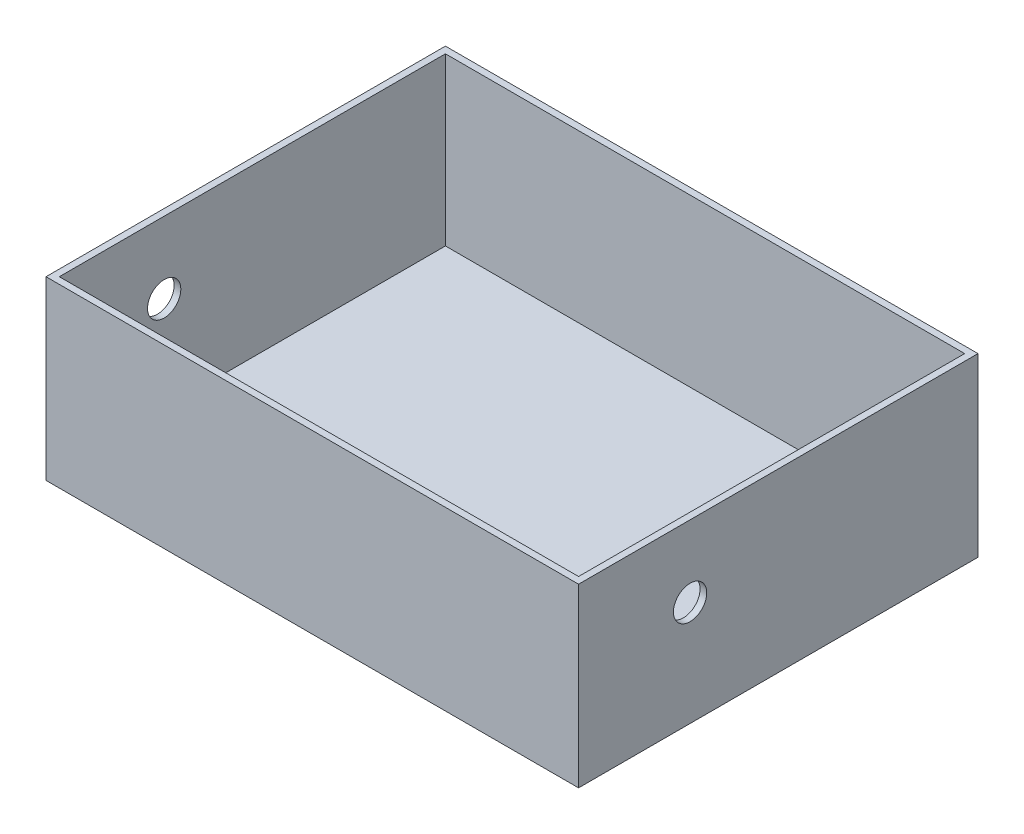
ISO-10303-21;
HEADER;
FILE_DESCRIPTION(('STEP AP214'),'2;1');
FILE_NAME('part.step','',(''),(''),'','','');
FILE_SCHEMA(('AUTOMOTIVE_DESIGN { 1 0 10303 214 1 1 1 1 }'));
ENDSEC;
DATA;
#1=APPLICATION_CONTEXT('core data for automotive mechanical design processes');
#2=APPLICATION_PROTOCOL_DEFINITION('international standard','automotive_design',2000,#1);
#3=PRODUCT_CONTEXT('',#1,'mechanical');
#4=PRODUCT('Part','Part','',(#3));
#5=PRODUCT_RELATED_PRODUCT_CATEGORY('part','',(#4));
#6=PRODUCT_DEFINITION_FORMATION('','',#4);
#7=PRODUCT_DEFINITION_CONTEXT('part definition',#1,'design');
#8=PRODUCT_DEFINITION('design','',#6,#7);
#9=PRODUCT_DEFINITION_SHAPE('','',#8);
#10=(LENGTH_UNIT() NAMED_UNIT(*) SI_UNIT(.MILLI.,.METRE.));
#11=(NAMED_UNIT(*) PLANE_ANGLE_UNIT() SI_UNIT($,.RADIAN.));
#12=(NAMED_UNIT(*) SI_UNIT($,.STERADIAN.) SOLID_ANGLE_UNIT());
#13=UNCERTAINTY_MEASURE_WITH_UNIT(LENGTH_MEASURE(1.E-05),#10,'distance_accuracy_value','');
#14=(GEOMETRIC_REPRESENTATION_CONTEXT(3) GLOBAL_UNCERTAINTY_ASSIGNED_CONTEXT((#13)) GLOBAL_UNIT_ASSIGNED_CONTEXT((#10,
#11,#12)) REPRESENTATION_CONTEXT('',''));
#15=CARTESIAN_POINT('',(0.,0.,0.));
#16=DIRECTION('',(0.,0.,1.));
#17=DIRECTION('',(1.,0.,0.));
#18=AXIS2_PLACEMENT_3D('',#15,#16,#17);
#19=CARTESIAN_POINT('',(80.,3.,60.));
#20=DIRECTION('',(-1.,0.,0.));
#21=DIRECTION('',(0.,0.,1.));
#22=AXIS2_PLACEMENT_3D('',#19,#20,#21);
#23=PLANE('',#22);
#24=CARTESIAN_POINT('',(80.,31.5,26.4999999999999));
#25=DIRECTION('',(1.,0.,0.));
#26=DIRECTION('',(0.,0.,-1.));
#27=AXIS2_PLACEMENT_3D('',#24,#25,#26);
#28=CIRCLE('',#27,5.);
#29=CARTESIAN_POINT('',(80.,31.5,21.4999999999999));
#30=VERTEX_POINT('',#29);
#31=EDGE_CURVE('E269',#30,#30,#28,.T.);
#32=ORIENTED_EDGE('',*,*,#31,.F.);
#33=EDGE_LOOP('',(#32));
#34=FACE_BOUND('',#33,.T.);
#35=DIRECTION('',(0.,0.,-1.));
#36=VECTOR('',#35,1.);
#37=CARTESIAN_POINT('',(80.,0.,60.));
#38=LINE('',#37,#36);
#39=CARTESIAN_POINT('',(80.,0.,60.));
#40=VERTEX_POINT('',#39);
#41=CARTESIAN_POINT('',(80.,0.,-60.));
#42=VERTEX_POINT('',#41);
#43=EDGE_CURVE('E191',#40,#42,#38,.T.);
#44=ORIENTED_EDGE('',*,*,#43,.T.);
#45=DIRECTION('',(0.,-1.,0.));
#46=VECTOR('',#45,1.);
#47=CARTESIAN_POINT('',(80.,3.,-60.));
#48=LINE('',#47,#46);
#49=CARTESIAN_POINT('',(80.,53.,-60.));
#50=VERTEX_POINT('',#49);
#51=EDGE_CURVE('E11',#50,#42,#48,.T.);
#52=ORIENTED_EDGE('',*,*,#51,.F.);
#53=DIRECTION('',(0.,0.,-1.));
#54=VECTOR('',#53,1.);
#55=CARTESIAN_POINT('',(80.,53.,60.));
#56=LINE('',#55,#54);
#57=CARTESIAN_POINT('',(80.,53.,60.));
#58=VERTEX_POINT('',#57);
#59=EDGE_CURVE('E180',#58,#50,#56,.T.);
#60=ORIENTED_EDGE('',*,*,#59,.F.);
#61=DIRECTION('',(0.,-1.,0.));
#62=VECTOR('',#61,1.);
#63=CARTESIAN_POINT('',(80.,3.,60.));
#64=LINE('',#63,#62);
#65=EDGE_CURVE('E202',#58,#40,#64,.T.);
#66=ORIENTED_EDGE('',*,*,#65,.T.);
#67=EDGE_LOOP('',(#44,#52,#60,#66));
#68=FACE_BOUND('',#67,.T.);
#69=ADVANCED_FACE('F43',(#34,#68),#23,.F.);
#70=CARTESIAN_POINT('',(-80.,3.,-60.));
#71=DIRECTION('',(0.,0.,1.));
#72=DIRECTION('',(1.,0.,0.));
#73=AXIS2_PLACEMENT_3D('',#70,#71,#72);
#74=PLANE('',#73);
#75=DIRECTION('',(-1.,0.,0.));
#76=VECTOR('',#75,1.);
#77=CARTESIAN_POINT('',(-80.,0.,-60.));
#78=LINE('',#77,#76);
#79=CARTESIAN_POINT('',(-80.,0.,-60.));
#80=VERTEX_POINT('',#79);
#81=EDGE_CURVE('E195',#42,#80,#78,.T.);
#82=ORIENTED_EDGE('',*,*,#81,.T.);
#83=DIRECTION('',(0.,-1.,0.));
#84=VECTOR('',#83,1.);
#85=CARTESIAN_POINT('',(-80.,3.,-60.));
#86=LINE('',#85,#84);
#87=CARTESIAN_POINT('',(-80.,53.,-60.));
#88=VERTEX_POINT('',#87);
#89=EDGE_CURVE('E52',#88,#80,#86,.T.);
#90=ORIENTED_EDGE('',*,*,#89,.F.);
#91=DIRECTION('',(-1.,0.,0.));
#92=VECTOR('',#91,1.);
#93=CARTESIAN_POINT('',(80.,53.,-60.));
#94=LINE('',#93,#92);
#95=EDGE_CURVE('E184',#50,#88,#94,.T.);
#96=ORIENTED_EDGE('',*,*,#95,.F.);
#97=ORIENTED_EDGE('',*,*,#51,.T.);
#98=EDGE_LOOP('',(#82,#90,#96,#97));
#99=FACE_BOUND('',#98,.T.);
#100=ADVANCED_FACE('F224',(#99),#74,.F.);
#101=CARTESIAN_POINT('',(-80.,3.,60.));
#102=DIRECTION('',(1.,0.,0.));
#103=DIRECTION('',(0.,0.,-1.));
#104=AXIS2_PLACEMENT_3D('',#101,#102,#103);
#105=PLANE('',#104);
#106=CARTESIAN_POINT('',(-80.,31.5,26.4999999999999));
#107=DIRECTION('',(1.,0.,0.));
#108=DIRECTION('',(0.,0.,-1.));
#109=AXIS2_PLACEMENT_3D('',#106,#107,#108);
#110=CIRCLE('',#109,5.);
#111=CARTESIAN_POINT('',(-80.,31.5,21.4999999999999));
#112=VERTEX_POINT('',#111);
#113=EDGE_CURVE('E271',#112,#112,#110,.T.);
#114=ORIENTED_EDGE('',*,*,#113,.T.);
#115=EDGE_LOOP('',(#114));
#116=FACE_BOUND('',#115,.T.);
#117=DIRECTION('',(0.,0.,1.));
#118=VECTOR('',#117,1.);
#119=CARTESIAN_POINT('',(-80.,0.,60.));
#120=LINE('',#119,#118);
#121=CARTESIAN_POINT('',(-80.,0.,60.));
#122=VERTEX_POINT('',#121);
#123=EDGE_CURVE('E198',#80,#122,#120,.T.);
#124=ORIENTED_EDGE('',*,*,#123,.T.);
#125=DIRECTION('',(0.,-1.,0.));
#126=VECTOR('',#125,1.);
#127=CARTESIAN_POINT('',(-80.,3.,60.));
#128=LINE('',#127,#126);
#129=CARTESIAN_POINT('',(-80.,53.,60.));
#130=VERTEX_POINT('',#129);
#131=EDGE_CURVE('E205',#130,#122,#128,.T.);
#132=ORIENTED_EDGE('',*,*,#131,.F.);
#133=DIRECTION('',(0.,0.,1.));
#134=VECTOR('',#133,1.);
#135=CARTESIAN_POINT('',(-80.,53.,-60.));
#136=LINE('',#135,#134);
#137=EDGE_CURVE('E188',#88,#130,#136,.T.);
#138=ORIENTED_EDGE('',*,*,#137,.F.);
#139=ORIENTED_EDGE('',*,*,#89,.T.);
#140=EDGE_LOOP('',(#124,#132,#138,#139));
#141=FACE_BOUND('',#140,.T.);
#142=ADVANCED_FACE('F213',(#116,#141),#105,.F.);
#143=CARTESIAN_POINT('',(-80.,3.,60.));
#144=DIRECTION('',(0.,0.,-1.));
#145=DIRECTION('',(-1.,0.,0.));
#146=AXIS2_PLACEMENT_3D('',#143,#144,#145);
#147=PLANE('',#146);
#148=DIRECTION('',(1.,0.,0.));
#149=VECTOR('',#148,1.);
#150=CARTESIAN_POINT('',(-80.,0.,60.));
#151=LINE('',#150,#149);
#152=EDGE_CURVE('E73',#122,#40,#151,.T.);
#153=ORIENTED_EDGE('',*,*,#152,.T.);
#154=ORIENTED_EDGE('',*,*,#65,.F.);
#155=DIRECTION('',(1.,0.,0.));
#156=VECTOR('',#155,1.);
#157=CARTESIAN_POINT('',(-80.,53.,60.));
#158=LINE('',#157,#156);
#159=EDGE_CURVE('E140',#130,#58,#158,.T.);
#160=ORIENTED_EDGE('',*,*,#159,.F.);
#161=ORIENTED_EDGE('',*,*,#131,.T.);
#162=EDGE_LOOP('',(#153,#154,#160,#161));
#163=FACE_BOUND('',#162,.T.);
#164=ADVANCED_FACE('F222',(#163),#147,.F.);
#165=CARTESIAN_POINT('',(0.,0.,0.));
#166=DIRECTION('',(0.,-1.,0.));
#167=DIRECTION('',(0.,0.,-1.));
#168=AXIS2_PLACEMENT_3D('',#165,#166,#167);
#169=PLANE('',#168);
#170=ORIENTED_EDGE('',*,*,#43,.F.);
#171=ORIENTED_EDGE('',*,*,#152,.F.);
#172=ORIENTED_EDGE('',*,*,#123,.F.);
#173=ORIENTED_EDGE('',*,*,#81,.F.);
#174=EDGE_LOOP('',(#170,#171,#172,#173));
#175=FACE_BOUND('',#174,.T.);
#176=ADVANCED_FACE('F218',(#175),#169,.T.);
#177=CARTESIAN_POINT('',(0.,53.,0.));
#178=DIRECTION('',(0.,1.,0.));
#179=DIRECTION('',(0.,0.,1.));
#180=AXIS2_PLACEMENT_3D('',#177,#178,#179);
#181=PLANE('',#180);
#182=ORIENTED_EDGE('',*,*,#159,.T.);
#183=ORIENTED_EDGE('',*,*,#59,.T.);
#184=ORIENTED_EDGE('',*,*,#95,.T.);
#185=ORIENTED_EDGE('',*,*,#137,.T.);
#186=EDGE_LOOP('',(#182,#183,#184,#185));
#187=FACE_BOUND('',#186,.T.);
#188=DIRECTION('',(1.,0.,0.));
#189=VECTOR('',#188,1.);
#190=CARTESIAN_POINT('',(-78.,53.,58.));
#191=LINE('',#190,#189);
#192=CARTESIAN_POINT('',(-78.,53.,58.));
#193=VERTEX_POINT('',#192);
#194=CARTESIAN_POINT('',(78.,53.,58.));
#195=VERTEX_POINT('',#194);
#196=EDGE_CURVE('E131',#193,#195,#191,.T.);
#197=ORIENTED_EDGE('',*,*,#196,.F.);
#198=DIRECTION('',(0.,0.,1.));
#199=VECTOR('',#198,1.);
#200=CARTESIAN_POINT('',(-78.,53.,-58.));
#201=LINE('',#200,#199);
#202=CARTESIAN_POINT('',(-78.,53.,-58.));
#203=VERTEX_POINT('',#202);
#204=EDGE_CURVE('E123',#203,#193,#201,.T.);
#205=ORIENTED_EDGE('',*,*,#204,.F.);
#206=DIRECTION('',(-1.,0.,0.));
#207=VECTOR('',#206,1.);
#208=CARTESIAN_POINT('',(-78.,53.,-58.));
#209=LINE('',#208,#207);
#210=CARTESIAN_POINT('',(78.,53.,-58.));
#211=VERTEX_POINT('',#210);
#212=EDGE_CURVE('E152',#211,#203,#209,.T.);
#213=ORIENTED_EDGE('',*,*,#212,.F.);
#214=DIRECTION('',(0.,0.,-1.));
#215=VECTOR('',#214,1.);
#216=CARTESIAN_POINT('',(78.,53.,-58.));
#217=LINE('',#216,#215);
#218=EDGE_CURVE('E146',#195,#211,#217,.T.);
#219=ORIENTED_EDGE('',*,*,#218,.F.);
#220=EDGE_LOOP('',(#197,#205,#213,#219));
#221=FACE_BOUND('',#220,.T.);
#222=ADVANCED_FACE('F144',(#187,#221),#181,.T.);
#223=CARTESIAN_POINT('',(-78.,53.,-58.));
#224=DIRECTION('',(1.,0.,0.));
#225=DIRECTION('',(0.,0.,-1.));
#226=AXIS2_PLACEMENT_3D('',#223,#224,#225);
#227=PLANE('',#226);
#228=CARTESIAN_POINT('',(-78.,31.5,26.4999999999999));
#229=DIRECTION('',(1.,0.,0.));
#230=DIRECTION('',(0.,0.,-1.));
#231=AXIS2_PLACEMENT_3D('',#228,#229,#230);
#232=CIRCLE('',#231,5.);
#233=CARTESIAN_POINT('',(-78.,31.5,21.4999999999999));
#234=VERTEX_POINT('',#233);
#235=EDGE_CURVE('E161',#234,#234,#232,.T.);
#236=ORIENTED_EDGE('',*,*,#235,.F.);
#237=EDGE_LOOP('',(#236));
#238=FACE_BOUND('',#237,.T.);
#239=DIRECTION('',(0.,0.,1.));
#240=VECTOR('',#239,1.);
#241=CARTESIAN_POINT('',(-78.,3.,-58.));
#242=LINE('',#241,#240);
#243=CARTESIAN_POINT('',(-78.,3.,-58.));
#244=VERTEX_POINT('',#243);
#245=CARTESIAN_POINT('',(-78.,3.,58.));
#246=VERTEX_POINT('',#245);
#247=EDGE_CURVE('E158',#244,#246,#242,.T.);
#248=ORIENTED_EDGE('',*,*,#247,.F.);
#249=DIRECTION('',(0.,-1.,0.));
#250=VECTOR('',#249,1.);
#251=CARTESIAN_POINT('',(-78.,53.,-58.));
#252=LINE('',#251,#250);
#253=EDGE_CURVE('E62',#203,#244,#252,.T.);
#254=ORIENTED_EDGE('',*,*,#253,.F.);
#255=ORIENTED_EDGE('',*,*,#204,.T.);
#256=DIRECTION('',(0.,-1.,0.));
#257=VECTOR('',#256,1.);
#258=CARTESIAN_POINT('',(-78.,53.,58.));
#259=LINE('',#258,#257);
#260=EDGE_CURVE('E126',#193,#246,#259,.T.);
#261=ORIENTED_EDGE('',*,*,#260,.T.);
#262=EDGE_LOOP('',(#248,#254,#255,#261));
#263=FACE_BOUND('',#262,.T.);
#264=ADVANCED_FACE('F125',(#238,#263),#227,.T.);
#265=CARTESIAN_POINT('',(-78.,53.,58.));
#266=DIRECTION('',(0.,0.,-1.));
#267=DIRECTION('',(-1.,0.,0.));
#268=AXIS2_PLACEMENT_3D('',#265,#266,#267);
#269=PLANE('',#268);
#270=DIRECTION('',(1.,0.,0.));
#271=VECTOR('',#270,1.);
#272=CARTESIAN_POINT('',(-78.,3.,58.));
#273=LINE('',#272,#271);
#274=CARTESIAN_POINT('',(78.,3.,58.));
#275=VERTEX_POINT('',#274);
#276=EDGE_CURVE('E138',#246,#275,#273,.T.);
#277=ORIENTED_EDGE('',*,*,#276,.F.);
#278=ORIENTED_EDGE('',*,*,#260,.F.);
#279=ORIENTED_EDGE('',*,*,#196,.T.);
#280=DIRECTION('',(0.,-1.,0.));
#281=VECTOR('',#280,1.);
#282=CARTESIAN_POINT('',(78.,53.,58.));
#283=LINE('',#282,#281);
#284=EDGE_CURVE('E141',#195,#275,#283,.T.);
#285=ORIENTED_EDGE('',*,*,#284,.T.);
#286=EDGE_LOOP('',(#277,#278,#279,#285));
#287=FACE_BOUND('',#286,.T.);
#288=ADVANCED_FACE('F135',(#287),#269,.T.);
#289=CARTESIAN_POINT('',(78.,53.,-58.));
#290=DIRECTION('',(-1.,0.,0.));
#291=DIRECTION('',(0.,0.,1.));
#292=AXIS2_PLACEMENT_3D('',#289,#290,#291);
#293=PLANE('',#292);
#294=CARTESIAN_POINT('',(78.,31.5,26.4999999999999));
#295=DIRECTION('',(-1.,0.,0.));
#296=DIRECTION('',(0.,0.,1.));
#297=AXIS2_PLACEMENT_3D('',#294,#295,#296);
#298=CIRCLE('',#297,5.);
#299=CARTESIAN_POINT('',(78.,31.5,31.4999999999999));
#300=VERTEX_POINT('',#299);
#301=EDGE_CURVE('E46',#300,#300,#298,.T.);
#302=ORIENTED_EDGE('',*,*,#301,.F.);
#303=EDGE_LOOP('',(#302));
#304=FACE_BOUND('',#303,.T.);
#305=DIRECTION('',(0.,0.,-1.));
#306=VECTOR('',#305,1.);
#307=CARTESIAN_POINT('',(78.,3.,-58.));
#308=LINE('',#307,#306);
#309=CARTESIAN_POINT('',(78.,3.,-58.));
#310=VERTEX_POINT('',#309);
#311=EDGE_CURVE('E164',#275,#310,#308,.T.);
#312=ORIENTED_EDGE('',*,*,#311,.F.);
#313=ORIENTED_EDGE('',*,*,#284,.F.);
#314=ORIENTED_EDGE('',*,*,#218,.T.);
#315=DIRECTION('',(0.,-1.,0.));
#316=VECTOR('',#315,1.);
#317=CARTESIAN_POINT('',(78.,53.,-58.));
#318=LINE('',#317,#316);
#319=EDGE_CURVE('E173',#211,#310,#318,.T.);
#320=ORIENTED_EDGE('',*,*,#319,.T.);
#321=EDGE_LOOP('',(#312,#313,#314,#320));
#322=FACE_BOUND('',#321,.T.);
#323=ADVANCED_FACE('F250',(#304,#322),#293,.T.);
#324=CARTESIAN_POINT('',(-78.,53.,-58.));
#325=DIRECTION('',(0.,0.,1.));
#326=DIRECTION('',(1.,0.,0.));
#327=AXIS2_PLACEMENT_3D('',#324,#325,#326);
#328=PLANE('',#327);
#329=DIRECTION('',(-1.,0.,0.));
#330=VECTOR('',#329,1.);
#331=CARTESIAN_POINT('',(-78.,3.,-58.));
#332=LINE('',#331,#330);
#333=EDGE_CURVE('E132',#310,#244,#332,.T.);
#334=ORIENTED_EDGE('',*,*,#333,.F.);
#335=ORIENTED_EDGE('',*,*,#319,.F.);
#336=ORIENTED_EDGE('',*,*,#212,.T.);
#337=ORIENTED_EDGE('',*,*,#253,.T.);
#338=EDGE_LOOP('',(#334,#335,#336,#337));
#339=FACE_BOUND('',#338,.T.);
#340=ADVANCED_FACE('F241',(#339),#328,.T.);
#341=CARTESIAN_POINT('',(0.,3.,0.));
#342=DIRECTION('',(0.,-1.,0.));
#343=DIRECTION('',(0.,0.,-1.));
#344=AXIS2_PLACEMENT_3D('',#341,#342,#343);
#345=PLANE('',#344);
#346=ORIENTED_EDGE('',*,*,#333,.T.);
#347=ORIENTED_EDGE('',*,*,#247,.T.);
#348=ORIENTED_EDGE('',*,*,#276,.T.);
#349=ORIENTED_EDGE('',*,*,#311,.T.);
#350=EDGE_LOOP('',(#346,#347,#348,#349));
#351=FACE_BOUND('',#350,.T.);
#352=ADVANCED_FACE('F238',(#351),#345,.F.);
#353=CARTESIAN_POINT('',(-80.,31.5,26.4999999999999));
#354=DIRECTION('',(1.,0.,0.));
#355=DIRECTION('',(0.,0.,-1.));
#356=AXIS2_PLACEMENT_3D('',#353,#354,#355);
#357=CYLINDRICAL_SURFACE('',#356,5.);
#358=ORIENTED_EDGE('',*,*,#301,.T.);
#359=EDGE_LOOP('',(#358));
#360=FACE_BOUND('',#359,.T.);
#361=ORIENTED_EDGE('',*,*,#31,.T.);
#362=EDGE_LOOP('',(#361));
#363=FACE_BOUND('',#362,.T.);
#364=ADVANCED_FACE('F240',(#360,#363),#357,.F.);
#365=ORIENTED_EDGE('',*,*,#235,.T.);
#366=EDGE_LOOP('',(#365));
#367=FACE_BOUND('',#366,.T.);
#368=ORIENTED_EDGE('',*,*,#113,.F.);
#369=EDGE_LOOP('',(#368));
#370=FACE_BOUND('',#369,.T.);
#371=ADVANCED_FACE('F257',(#367,#370),#357,.F.);
#372=CLOSED_SHELL('',(#69,#100,#142,#164,#176,#222,#264,#288,#323,#340,#352,#364,#371));
#373=MANIFOLD_SOLID_BREP('B2',#372);
#374=ADVANCED_BREP_SHAPE_REPRESENTATION('',(#18,#373),#14);
#375=SHAPE_DEFINITION_REPRESENTATION(#9,#374);
ENDSEC;
END-ISO-10303-21;
